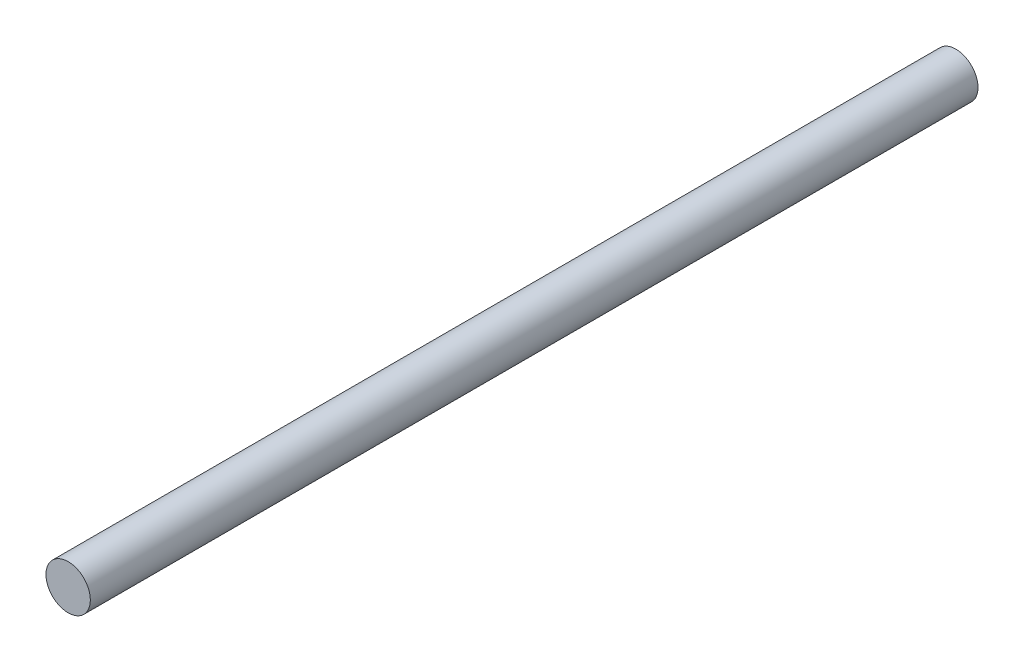
ISO-10303-21;
HEADER;
FILE_DESCRIPTION(('STEP AP214'),'2;1');
FILE_NAME('part.step','',(''),(''),'','','');
FILE_SCHEMA(('AUTOMOTIVE_DESIGN { 1 0 10303 214 1 1 1 1 }'));
ENDSEC;
DATA;
#1=APPLICATION_CONTEXT('core data for automotive mechanical design processes');
#2=APPLICATION_PROTOCOL_DEFINITION('international standard','automotive_design',2000,#1);
#3=PRODUCT_CONTEXT('',#1,'mechanical');
#4=PRODUCT('Part','Part','',(#3));
#5=PRODUCT_RELATED_PRODUCT_CATEGORY('part','',(#4));
#6=PRODUCT_DEFINITION_FORMATION('','',#4);
#7=PRODUCT_DEFINITION_CONTEXT('part definition',#1,'design');
#8=PRODUCT_DEFINITION('design','',#6,#7);
#9=PRODUCT_DEFINITION_SHAPE('','',#8);
#10=(LENGTH_UNIT() NAMED_UNIT(*) SI_UNIT(.MILLI.,.METRE.));
#11=(NAMED_UNIT(*) PLANE_ANGLE_UNIT() SI_UNIT($,.RADIAN.));
#12=(NAMED_UNIT(*) SI_UNIT($,.STERADIAN.) SOLID_ANGLE_UNIT());
#13=UNCERTAINTY_MEASURE_WITH_UNIT(LENGTH_MEASURE(1.E-05),#10,'distance_accuracy_value','');
#14=(GEOMETRIC_REPRESENTATION_CONTEXT(3) GLOBAL_UNCERTAINTY_ASSIGNED_CONTEXT((#13)) GLOBAL_UNIT_ASSIGNED_CONTEXT((#10,
#11,#12)) REPRESENTATION_CONTEXT('',''));
#15=CARTESIAN_POINT('',(0.,0.,0.));
#16=DIRECTION('',(0.,0.,1.));
#17=DIRECTION('',(1.,0.,0.));
#18=AXIS2_PLACEMENT_3D('',#15,#16,#17);
#19=CARTESIAN_POINT('',(0.,0.,-140.));
#20=DIRECTION('',(0.,0.,1.));
#21=DIRECTION('',(1.,0.,0.));
#22=AXIS2_PLACEMENT_3D('',#19,#20,#21);
#23=CYLINDRICAL_SURFACE('',#22,2.5);
#24=CARTESIAN_POINT('',(0.,0.,-140.));
#25=DIRECTION('',(0.,0.,1.));
#26=DIRECTION('',(1.,0.,0.));
#27=AXIS2_PLACEMENT_3D('',#24,#25,#26);
#28=CIRCLE('',#27,2.5);
#29=CARTESIAN_POINT('',(2.5,0.,-140.));
#30=VERTEX_POINT('',#29);
#31=EDGE_CURVE('E10',#30,#30,#28,.T.);
#32=ORIENTED_EDGE('',*,*,#31,.T.);
#33=EDGE_LOOP('',(#32));
#34=FACE_BOUND('',#33,.T.);
#35=CARTESIAN_POINT('',(0.,0.,-40.));
#36=DIRECTION('',(0.,0.,1.));
#37=DIRECTION('',(1.,0.,0.));
#38=AXIS2_PLACEMENT_3D('',#35,#36,#37);
#39=CIRCLE('',#38,2.5);
#40=CARTESIAN_POINT('',(2.5,0.,-40.));
#41=VERTEX_POINT('',#40);
#42=EDGE_CURVE('E40',#41,#41,#39,.T.);
#43=ORIENTED_EDGE('',*,*,#42,.F.);
#44=EDGE_LOOP('',(#43));
#45=FACE_BOUND('',#44,.T.);
#46=ADVANCED_FACE('F37',(#34,#45),#23,.T.);
#47=CARTESIAN_POINT('',(0.,0.,-140.));
#48=DIRECTION('',(0.,0.,1.));
#49=DIRECTION('',(1.,0.,0.));
#50=AXIS2_PLACEMENT_3D('',#47,#48,#49);
#51=PLANE('',#50);
#52=ORIENTED_EDGE('',*,*,#31,.F.);
#53=EDGE_LOOP('',(#52));
#54=FACE_BOUND('',#53,.T.);
#55=ADVANCED_FACE('F52',(#54),#51,.F.);
#56=CARTESIAN_POINT('',(0.,0.,-40.));
#57=DIRECTION('',(0.,0.,1.));
#58=DIRECTION('',(1.,0.,0.));
#59=AXIS2_PLACEMENT_3D('',#56,#57,#58);
#60=PLANE('',#59);
#61=ORIENTED_EDGE('',*,*,#42,.T.);
#62=EDGE_LOOP('',(#61));
#63=FACE_BOUND('',#62,.T.);
#64=ADVANCED_FACE('F49',(#63),#60,.T.);
#65=CLOSED_SHELL('',(#46,#55,#64));
#66=MANIFOLD_SOLID_BREP('B2',#65);
#67=ADVANCED_BREP_SHAPE_REPRESENTATION('',(#18,#66),#14);
#68=SHAPE_DEFINITION_REPRESENTATION(#9,#67);
ENDSEC;
END-ISO-10303-21;
